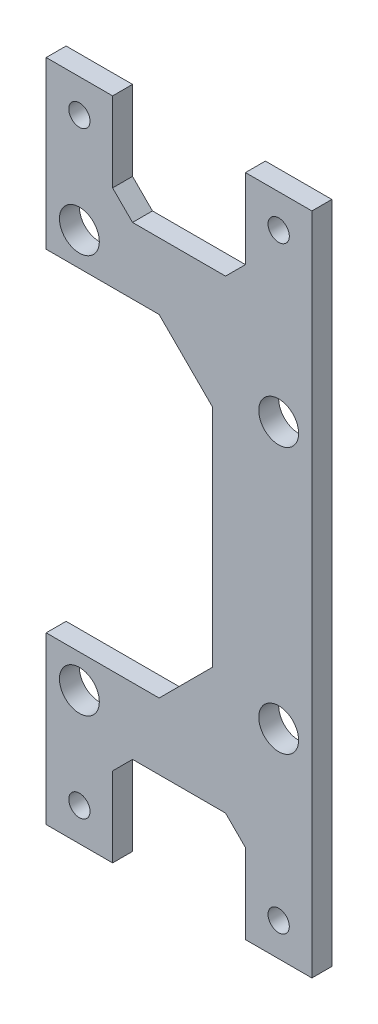
ISO-10303-21;
HEADER;
FILE_DESCRIPTION(('STEP AP214'),'2;1');
FILE_NAME('part.step','',(''),(''),'','','');
FILE_SCHEMA(('AUTOMOTIVE_DESIGN { 1 0 10303 214 1 1 1 1 }'));
ENDSEC;
DATA;
#1=APPLICATION_CONTEXT('core data for automotive mechanical design processes');
#2=APPLICATION_PROTOCOL_DEFINITION('international standard','automotive_design',2000,#1);
#3=PRODUCT_CONTEXT('',#1,'mechanical');
#4=PRODUCT('Part','Part','',(#3));
#5=PRODUCT_RELATED_PRODUCT_CATEGORY('part','',(#4));
#6=PRODUCT_DEFINITION_FORMATION('','',#4);
#7=PRODUCT_DEFINITION_CONTEXT('part definition',#1,'design');
#8=PRODUCT_DEFINITION('design','',#6,#7);
#9=PRODUCT_DEFINITION_SHAPE('','',#8);
#10=(LENGTH_UNIT() NAMED_UNIT(*) SI_UNIT(.MILLI.,.METRE.));
#11=(NAMED_UNIT(*) PLANE_ANGLE_UNIT() SI_UNIT($,.RADIAN.));
#12=(NAMED_UNIT(*) SI_UNIT($,.STERADIAN.) SOLID_ANGLE_UNIT());
#13=UNCERTAINTY_MEASURE_WITH_UNIT(LENGTH_MEASURE(1.E-05),#10,'distance_accuracy_value','');
#14=(GEOMETRIC_REPRESENTATION_CONTEXT(3) GLOBAL_UNCERTAINTY_ASSIGNED_CONTEXT((#13)) GLOBAL_UNIT_ASSIGNED_CONTEXT((#10,
#11,#12)) REPRESENTATION_CONTEXT('',''));
#15=CARTESIAN_POINT('',(0.,0.,0.));
#16=DIRECTION('',(0.,0.,1.));
#17=DIRECTION('',(1.,0.,0.));
#18=AXIS2_PLACEMENT_3D('',#15,#16,#17);
#19=CARTESIAN_POINT('',(0.,0.,3.));
#20=DIRECTION('',(1.,0.,0.));
#21=DIRECTION('',(0.,0.,-1.));
#22=AXIS2_PLACEMENT_3D('',#19,#20,#21);
#23=PLANE('',#22);
#24=DIRECTION('',(0.,-1.,0.));
#25=VECTOR('',#24,1.);
#26=CARTESIAN_POINT('',(0.,0.,0.));
#27=LINE('',#26,#25);
#28=CARTESIAN_POINT('',(0.,100.,0.));
#29=VERTEX_POINT('',#28);
#30=CARTESIAN_POINT('',(0.,75.,0.));
#31=VERTEX_POINT('',#30);
#32=EDGE_CURVE('E227',#29,#31,#27,.T.);
#33=ORIENTED_EDGE('',*,*,#32,.T.);
#34=DIRECTION('',(0.,0.,-1.));
#35=VECTOR('',#34,1.);
#36=CARTESIAN_POINT('',(0.,75.,3.));
#37=LINE('',#36,#35);
#38=CARTESIAN_POINT('',(0.,75.,3.));
#39=VERTEX_POINT('',#38);
#40=EDGE_CURVE('E201',#39,#31,#37,.T.);
#41=ORIENTED_EDGE('',*,*,#40,.F.);
#42=DIRECTION('',(0.,-1.,0.));
#43=VECTOR('',#42,1.);
#44=CARTESIAN_POINT('',(0.,0.,3.));
#45=LINE('',#44,#43);
#46=CARTESIAN_POINT('',(0.,100.,3.));
#47=VERTEX_POINT('',#46);
#48=EDGE_CURVE('E207',#47,#39,#45,.T.);
#49=ORIENTED_EDGE('',*,*,#48,.F.);
#50=DIRECTION('',(0.,0.,-1.));
#51=VECTOR('',#50,1.);
#52=CARTESIAN_POINT('',(0.,100.,3.));
#53=LINE('',#52,#51);
#54=EDGE_CURVE('E226',#47,#29,#53,.T.);
#55=ORIENTED_EDGE('',*,*,#54,.T.);
#56=EDGE_LOOP('',(#33,#41,#49,#55));
#57=FACE_BOUND('',#56,.T.);
#58=ADVANCED_FACE('F35',(#57),#23,.F.);
#59=CARTESIAN_POINT('',(0.,0.,3.));
#60=DIRECTION('',(0.,1.,0.));
#61=DIRECTION('',(0.,0.,1.));
#62=AXIS2_PLACEMENT_3D('',#59,#60,#61);
#63=PLANE('',#62);
#64=DIRECTION('',(1.,0.,0.));
#65=VECTOR('',#64,1.);
#66=CARTESIAN_POINT('',(0.,0.,0.));
#67=LINE('',#66,#65);
#68=CARTESIAN_POINT('',(0.,0.,0.));
#69=VERTEX_POINT('',#68);
#70=CARTESIAN_POINT('',(10.,0.,0.));
#71=VERTEX_POINT('',#70);
#72=EDGE_CURVE('E232',#69,#71,#67,.T.);
#73=ORIENTED_EDGE('',*,*,#72,.T.);
#74=DIRECTION('',(0.,0.,1.));
#75=VECTOR('',#74,1.);
#76=CARTESIAN_POINT('',(10.,0.,0.));
#77=LINE('',#76,#75);
#78=CARTESIAN_POINT('',(10.,0.,3.));
#79=VERTEX_POINT('',#78);
#80=EDGE_CURVE('E383',#71,#79,#77,.T.);
#81=ORIENTED_EDGE('',*,*,#80,.T.);
#82=DIRECTION('',(1.,0.,0.));
#83=VECTOR('',#82,1.);
#84=CARTESIAN_POINT('',(0.,0.,3.));
#85=LINE('',#84,#83);
#86=CARTESIAN_POINT('',(0.,0.,3.));
#87=VERTEX_POINT('',#86);
#88=EDGE_CURVE('E218',#87,#79,#85,.T.);
#89=ORIENTED_EDGE('',*,*,#88,.F.);
#90=DIRECTION('',(0.,0.,-1.));
#91=VECTOR('',#90,1.);
#92=CARTESIAN_POINT('',(0.,0.,3.));
#93=LINE('',#92,#91);
#94=EDGE_CURVE('E206',#87,#69,#93,.T.);
#95=ORIENTED_EDGE('',*,*,#94,.T.);
#96=EDGE_LOOP('',(#73,#81,#89,#95));
#97=FACE_BOUND('',#96,.T.);
#98=ADVANCED_FACE('F313',(#97),#63,.F.);
#99=CARTESIAN_POINT('',(0.,100.,3.));
#100=DIRECTION('',(0.,-1.,0.));
#101=DIRECTION('',(1.,0.,0.));
#102=AXIS2_PLACEMENT_3D('',#99,#100,#101);
#103=PLANE('',#102);
#104=DIRECTION('',(-1.,0.,0.));
#105=VECTOR('',#104,1.);
#106=CARTESIAN_POINT('',(0.,100.,3.));
#107=LINE('',#106,#105);
#108=CARTESIAN_POINT('',(10.,100.,3.));
#109=VERTEX_POINT('',#108);
#110=EDGE_CURVE('E222',#109,#47,#107,.T.);
#111=ORIENTED_EDGE('',*,*,#110,.F.);
#112=DIRECTION('',(0.,0.,1.));
#113=VECTOR('',#112,1.);
#114=CARTESIAN_POINT('',(10.,100.,0.));
#115=LINE('',#114,#113);
#116=CARTESIAN_POINT('',(10.,100.,0.));
#117=VERTEX_POINT('',#116);
#118=EDGE_CURVE('E368',#117,#109,#115,.T.);
#119=ORIENTED_EDGE('',*,*,#118,.F.);
#120=DIRECTION('',(-1.,0.,0.));
#121=VECTOR('',#120,1.);
#122=CARTESIAN_POINT('',(0.,100.,0.));
#123=LINE('',#122,#121);
#124=EDGE_CURVE('E212',#117,#29,#123,.T.);
#125=ORIENTED_EDGE('',*,*,#124,.T.);
#126=ORIENTED_EDGE('',*,*,#54,.F.);
#127=EDGE_LOOP('',(#111,#119,#125,#126));
#128=FACE_BOUND('',#127,.T.);
#129=ADVANCED_FACE('F319',(#128),#103,.F.);
#130=CARTESIAN_POINT('',(0.,0.,3.));
#131=DIRECTION('',(0.,0.,-1.));
#132=DIRECTION('',(-1.,0.,0.));
#133=AXIS2_PLACEMENT_3D('',#130,#131,#132);
#134=PLANE('',#133);
#135=ORIENTED_EDGE('',*,*,#48,.T.);
#136=DIRECTION('',(1.,0.,0.));
#137=VECTOR('',#136,1.);
#138=CARTESIAN_POINT('',(25.,75.,3.));
#139=LINE('',#138,#137);
#140=CARTESIAN_POINT('',(17.,75.,3.));
#141=VERTEX_POINT('',#140);
#142=EDGE_CURVE('E191',#39,#141,#139,.T.);
#143=ORIENTED_EDGE('',*,*,#142,.T.);
#144=DIRECTION('',(-0.707106781186545,0.70710678118655,0.));
#145=VECTOR('',#144,1.);
#146=CARTESIAN_POINT('',(46.0000000000001,45.9999999999998,3.));
#147=LINE('',#146,#145);
#148=CARTESIAN_POINT('',(25.,67.,3.));
#149=VERTEX_POINT('',#148);
#150=EDGE_CURVE('E293',#141,#149,#147,.F.);
#151=ORIENTED_EDGE('',*,*,#150,.T.);
#152=DIRECTION('',(0.,-1.,0.));
#153=VECTOR('',#152,1.);
#154=CARTESIAN_POINT('',(25.,75.,3.));
#155=LINE('',#154,#153);
#156=CARTESIAN_POINT('',(25.,33.,3.));
#157=VERTEX_POINT('',#156);
#158=EDGE_CURVE('E192',#149,#157,#155,.T.);
#159=ORIENTED_EDGE('',*,*,#158,.T.);
#160=DIRECTION('',(0.707106781186551,0.707106781186544,0.));
#161=VECTOR('',#160,1.);
#162=CARTESIAN_POINT('',(-4.00000000000012,4.00000000000017,3.));
#163=LINE('',#162,#161);
#164=CARTESIAN_POINT('',(16.9999999999999,25.,3.));
#165=VERTEX_POINT('',#164);
#166=EDGE_CURVE('E11',#157,#165,#163,.F.);
#167=ORIENTED_EDGE('',*,*,#166,.T.);
#168=DIRECTION('',(-1.,0.,0.));
#169=VECTOR('',#168,1.);
#170=CARTESIAN_POINT('',(25.,25.,3.));
#171=LINE('',#170,#169);
#172=CARTESIAN_POINT('',(0.,25.,3.));
#173=VERTEX_POINT('',#172);
#174=EDGE_CURVE('E181',#165,#173,#171,.T.);
#175=ORIENTED_EDGE('',*,*,#174,.T.);
#176=EDGE_CURVE('E188',#173,#87,#45,.T.);
#177=ORIENTED_EDGE('',*,*,#176,.T.);
#178=ORIENTED_EDGE('',*,*,#88,.T.);
#179=DIRECTION('',(0.,-1.,0.));
#180=VECTOR('',#179,1.);
#181=CARTESIAN_POINT('',(10.,15.,3.));
#182=LINE('',#181,#180);
#183=CARTESIAN_POINT('',(10.,12.,3.));
#184=VERTEX_POINT('',#183);
#185=EDGE_CURVE('E384',#184,#79,#182,.T.);
#186=ORIENTED_EDGE('',*,*,#185,.F.);
#187=DIRECTION('',(-0.707106781186544,-0.707106781186551,0.));
#188=VECTOR('',#187,1.);
#189=CARTESIAN_POINT('',(-0.999999999999937,0.999999999999928,3.));
#190=LINE('',#189,#188);
#191=CARTESIAN_POINT('',(13.,15.,3.));
#192=VERTEX_POINT('',#191);
#193=EDGE_CURVE('E266',#184,#192,#190,.F.);
#194=ORIENTED_EDGE('',*,*,#193,.T.);
#195=DIRECTION('',(-1.,0.,0.));
#196=VECTOR('',#195,1.);
#197=CARTESIAN_POINT('',(10.,15.,3.));
#198=LINE('',#197,#196);
#199=CARTESIAN_POINT('',(27.,15.,3.));
#200=VERTEX_POINT('',#199);
#201=EDGE_CURVE('E377',#200,#192,#198,.T.);
#202=ORIENTED_EDGE('',*,*,#201,.F.);
#203=DIRECTION('',(-0.707106781186552,0.707106781186543,0.));
#204=VECTOR('',#203,1.);
#205=CARTESIAN_POINT('',(20.9999999999998,21.0000000000001,3.));
#206=LINE('',#205,#204);
#207=CARTESIAN_POINT('',(30.,12.,3.));
#208=VERTEX_POINT('',#207);
#209=EDGE_CURVE('E270',#200,#208,#206,.F.);
#210=ORIENTED_EDGE('',*,*,#209,.T.);
#211=DIRECTION('',(0.,1.,0.));
#212=VECTOR('',#211,1.);
#213=CARTESIAN_POINT('',(30.,15.,3.));
#214=LINE('',#213,#212);
#215=CARTESIAN_POINT('',(30.,0.,3.));
#216=VERTEX_POINT('',#215);
#217=EDGE_CURVE('E386',#216,#208,#214,.T.);
#218=ORIENTED_EDGE('',*,*,#217,.F.);
#219=CARTESIAN_POINT('',(40.,0.,3.));
#220=VERTEX_POINT('',#219);
#221=EDGE_CURVE('E210',#216,#220,#85,.T.);
#222=ORIENTED_EDGE('',*,*,#221,.T.);
#223=DIRECTION('',(0.,1.,0.));
#224=VECTOR('',#223,1.);
#225=CARTESIAN_POINT('',(40.,0.,3.));
#226=LINE('',#225,#224);
#227=CARTESIAN_POINT('',(40.,100.,3.));
#228=VERTEX_POINT('',#227);
#229=EDGE_CURVE('E220',#220,#228,#226,.T.);
#230=ORIENTED_EDGE('',*,*,#229,.T.);
#231=CARTESIAN_POINT('',(30.,100.,3.));
#232=VERTEX_POINT('',#231);
#233=EDGE_CURVE('E223',#228,#232,#107,.T.);
#234=ORIENTED_EDGE('',*,*,#233,.T.);
#235=DIRECTION('',(0.,1.,0.));
#236=VECTOR('',#235,1.);
#237=CARTESIAN_POINT('',(30.,100.,3.));
#238=LINE('',#237,#236);
#239=CARTESIAN_POINT('',(30.,88.,3.));
#240=VERTEX_POINT('',#239);
#241=EDGE_CURVE('E367',#240,#232,#238,.T.);
#242=ORIENTED_EDGE('',*,*,#241,.F.);
#243=DIRECTION('',(0.707106781186543,0.707106781186552,0.));
#244=VECTOR('',#243,1.);
#245=CARTESIAN_POINT('',(-28.9999999999998,28.9999999999994,3.));
#246=LINE('',#245,#244);
#247=CARTESIAN_POINT('',(27.,85.,3.));
#248=VERTEX_POINT('',#247);
#249=EDGE_CURVE('E278',#240,#248,#246,.F.);
#250=ORIENTED_EDGE('',*,*,#249,.T.);
#251=DIRECTION('',(1.,0.,0.));
#252=VECTOR('',#251,1.);
#253=CARTESIAN_POINT('',(10.,85.,3.));
#254=LINE('',#253,#252);
#255=CARTESIAN_POINT('',(13.0000000000001,85.,3.));
#256=VERTEX_POINT('',#255);
#257=EDGE_CURVE('E529',#256,#248,#254,.T.);
#258=ORIENTED_EDGE('',*,*,#257,.F.);
#259=DIRECTION('',(0.707106781186551,-0.707106781186544,0.));
#260=VECTOR('',#259,1.);
#261=CARTESIAN_POINT('',(49.,49.0000000000004,3.));
#262=LINE('',#261,#260);
#263=CARTESIAN_POINT('',(10.,88.,3.));
#264=VERTEX_POINT('',#263);
#265=EDGE_CURVE('E274',#256,#264,#262,.F.);
#266=ORIENTED_EDGE('',*,*,#265,.T.);
#267=DIRECTION('',(0.,-1.,0.));
#268=VECTOR('',#267,1.);
#269=CARTESIAN_POINT('',(10.,100.,3.));
#270=LINE('',#269,#268);
#271=EDGE_CURVE('E393',#109,#264,#270,.T.);
#272=ORIENTED_EDGE('',*,*,#271,.F.);
#273=ORIENTED_EDGE('',*,*,#110,.T.);
#274=EDGE_LOOP('',(#135,#143,#151,#159,#167,#175,#177,#178,#186,#194,#202,#210,#218,#222,#230,
#234,#242,#250,#258,#266,#272,#273));
#275=FACE_BOUND('',#274,.T.);
#276=CARTESIAN_POINT('',(5.,95.,3.));
#277=DIRECTION('',(0.,0.,1.));
#278=DIRECTION('',(1.,0.,0.));
#279=AXIS2_PLACEMENT_3D('',#276,#277,#278);
#280=CIRCLE('',#279,1.60000000000002);
#281=CARTESIAN_POINT('',(6.60000000000002,95.,3.));
#282=VERTEX_POINT('',#281);
#283=EDGE_CURVE('E436',#282,#282,#280,.T.);
#284=ORIENTED_EDGE('',*,*,#283,.F.);
#285=EDGE_LOOP('',(#284));
#286=FACE_BOUND('',#285,.T.);
#287=CARTESIAN_POINT('',(35.,95.,3.));
#288=DIRECTION('',(0.,0.,1.));
#289=DIRECTION('',(1.,0.,0.));
#290=AXIS2_PLACEMENT_3D('',#287,#288,#289);
#291=CIRCLE('',#290,1.60000000000001);
#292=CARTESIAN_POINT('',(36.6,95.,3.));
#293=VERTEX_POINT('',#292);
#294=EDGE_CURVE('E432',#293,#293,#291,.T.);
#295=ORIENTED_EDGE('',*,*,#294,.F.);
#296=EDGE_LOOP('',(#295));
#297=FACE_BOUND('',#296,.T.);
#298=CARTESIAN_POINT('',(5.,80.,3.));
#299=DIRECTION('',(0.,0.,1.));
#300=DIRECTION('',(1.,0.,0.));
#301=AXIS2_PLACEMENT_3D('',#298,#299,#300);
#302=CIRCLE('',#301,3.);
#303=CARTESIAN_POINT('',(8.,80.,3.));
#304=VERTEX_POINT('',#303);
#305=EDGE_CURVE('E426',#304,#304,#302,.T.);
#306=ORIENTED_EDGE('',*,*,#305,.F.);
#307=EDGE_LOOP('',(#306));
#308=FACE_BOUND('',#307,.T.);
#309=CARTESIAN_POINT('',(35.,70.,3.));
#310=DIRECTION('',(0.,0.,1.));
#311=DIRECTION('',(1.,0.,0.));
#312=AXIS2_PLACEMENT_3D('',#309,#310,#311);
#313=CIRCLE('',#312,3.);
#314=CARTESIAN_POINT('',(38.,70.,3.));
#315=VERTEX_POINT('',#314);
#316=EDGE_CURVE('E420',#315,#315,#313,.T.);
#317=ORIENTED_EDGE('',*,*,#316,.F.);
#318=EDGE_LOOP('',(#317));
#319=FACE_BOUND('',#318,.T.);
#320=CARTESIAN_POINT('',(5.,20.,3.));
#321=DIRECTION('',(0.,0.,1.));
#322=DIRECTION('',(1.,0.,0.));
#323=AXIS2_PLACEMENT_3D('',#320,#321,#322);
#324=CIRCLE('',#323,3.);
#325=CARTESIAN_POINT('',(8.,20.,3.));
#326=VERTEX_POINT('',#325);
#327=EDGE_CURVE('E414',#326,#326,#324,.T.);
#328=ORIENTED_EDGE('',*,*,#327,.F.);
#329=EDGE_LOOP('',(#328));
#330=FACE_BOUND('',#329,.T.);
#331=CARTESIAN_POINT('',(35.,30.,3.));
#332=DIRECTION('',(0.,0.,1.));
#333=DIRECTION('',(1.,0.,0.));
#334=AXIS2_PLACEMENT_3D('',#331,#332,#333);
#335=CIRCLE('',#334,3.);
#336=CARTESIAN_POINT('',(38.,30.,3.));
#337=VERTEX_POINT('',#336);
#338=EDGE_CURVE('E408',#337,#337,#335,.T.);
#339=ORIENTED_EDGE('',*,*,#338,.F.);
#340=EDGE_LOOP('',(#339));
#341=FACE_BOUND('',#340,.T.);
#342=CARTESIAN_POINT('',(5.,5.,3.));
#343=DIRECTION('',(0.,0.,1.));
#344=DIRECTION('',(1.,0.,0.));
#345=AXIS2_PLACEMENT_3D('',#342,#343,#344);
#346=CIRCLE('',#345,1.6);
#347=CARTESIAN_POINT('',(6.6,5.,3.));
#348=VERTEX_POINT('',#347);
#349=EDGE_CURVE('E402',#348,#348,#346,.T.);
#350=ORIENTED_EDGE('',*,*,#349,.F.);
#351=EDGE_LOOP('',(#350));
#352=FACE_BOUND('',#351,.T.);
#353=CARTESIAN_POINT('',(35.,5.,3.));
#354=DIRECTION('',(0.,0.,1.));
#355=DIRECTION('',(1.,0.,0.));
#356=AXIS2_PLACEMENT_3D('',#353,#354,#355);
#357=CIRCLE('',#356,1.6);
#358=CARTESIAN_POINT('',(36.6,5.,3.));
#359=VERTEX_POINT('',#358);
#360=EDGE_CURVE('E396',#359,#359,#357,.T.);
#361=ORIENTED_EDGE('',*,*,#360,.F.);
#362=EDGE_LOOP('',(#361));
#363=FACE_BOUND('',#362,.T.);
#364=ADVANCED_FACE('F184',(#275,#286,#297,#308,#319,#330,#341,#352,#363),#134,.F.);
#365=CARTESIAN_POINT('',(0.,0.,0.));
#366=DIRECTION('',(0.,0.,-1.));
#367=DIRECTION('',(-1.,0.,0.));
#368=AXIS2_PLACEMENT_3D('',#365,#366,#367);
#369=PLANE('',#368);
#370=DIRECTION('',(1.,0.,0.));
#371=VECTOR('',#370,1.);
#372=CARTESIAN_POINT('',(25.,75.,0.));
#373=LINE('',#372,#371);
#374=CARTESIAN_POINT('',(17.,75.,0.));
#375=VERTEX_POINT('',#374);
#376=EDGE_CURVE('E511',#31,#375,#373,.T.);
#377=ORIENTED_EDGE('',*,*,#376,.F.);
#378=ORIENTED_EDGE('',*,*,#32,.F.);
#379=ORIENTED_EDGE('',*,*,#124,.F.);
#380=DIRECTION('',(0.,-1.,0.));
#381=VECTOR('',#380,1.);
#382=CARTESIAN_POINT('',(10.,100.,0.));
#383=LINE('',#382,#381);
#384=CARTESIAN_POINT('',(10.,88.,0.));
#385=VERTEX_POINT('',#384);
#386=EDGE_CURVE('E523',#117,#385,#383,.T.);
#387=ORIENTED_EDGE('',*,*,#386,.T.);
#388=DIRECTION('',(-0.707106781186551,0.707106781186544,0.));
#389=VECTOR('',#388,1.);
#390=CARTESIAN_POINT('',(13.0000000000001,85.,0.));
#391=LINE('',#390,#389);
#392=CARTESIAN_POINT('',(13.0000000000001,85.,0.));
#393=VERTEX_POINT('',#392);
#394=EDGE_CURVE('E276',#385,#393,#391,.F.);
#395=ORIENTED_EDGE('',*,*,#394,.T.);
#396=DIRECTION('',(1.,0.,0.));
#397=VECTOR('',#396,1.);
#398=CARTESIAN_POINT('',(10.,85.,0.));
#399=LINE('',#398,#397);
#400=CARTESIAN_POINT('',(27.,85.,0.));
#401=VERTEX_POINT('',#400);
#402=EDGE_CURVE('E363',#393,#401,#399,.T.);
#403=ORIENTED_EDGE('',*,*,#402,.T.);
#404=DIRECTION('',(-0.707106781186543,-0.707106781186552,0.));
#405=VECTOR('',#404,1.);
#406=CARTESIAN_POINT('',(30.,88.,0.));
#407=LINE('',#406,#405);
#408=CARTESIAN_POINT('',(30.,88.,0.));
#409=VERTEX_POINT('',#408);
#410=EDGE_CURVE('E280',#401,#409,#407,.F.);
#411=ORIENTED_EDGE('',*,*,#410,.T.);
#412=DIRECTION('',(0.,1.,0.));
#413=VECTOR('',#412,1.);
#414=CARTESIAN_POINT('',(30.,100.,0.));
#415=LINE('',#414,#413);
#416=CARTESIAN_POINT('',(30.,100.,0.));
#417=VERTEX_POINT('',#416);
#418=EDGE_CURVE('E356',#409,#417,#415,.T.);
#419=ORIENTED_EDGE('',*,*,#418,.T.);
#420=CARTESIAN_POINT('',(40.,100.,0.));
#421=VERTEX_POINT('',#420);
#422=EDGE_CURVE('E208',#421,#417,#123,.T.);
#423=ORIENTED_EDGE('',*,*,#422,.F.);
#424=DIRECTION('',(0.,1.,0.));
#425=VECTOR('',#424,1.);
#426=CARTESIAN_POINT('',(40.,0.,0.));
#427=LINE('',#426,#425);
#428=CARTESIAN_POINT('',(40.,0.,0.));
#429=VERTEX_POINT('',#428);
#430=EDGE_CURVE('E235',#429,#421,#427,.T.);
#431=ORIENTED_EDGE('',*,*,#430,.F.);
#432=CARTESIAN_POINT('',(30.,0.,0.));
#433=VERTEX_POINT('',#432);
#434=EDGE_CURVE('E230',#433,#429,#67,.T.);
#435=ORIENTED_EDGE('',*,*,#434,.F.);
#436=DIRECTION('',(0.,1.,0.));
#437=VECTOR('',#436,1.);
#438=CARTESIAN_POINT('',(30.,15.,0.));
#439=LINE('',#438,#437);
#440=CARTESIAN_POINT('',(30.,12.,0.));
#441=VERTEX_POINT('',#440);
#442=EDGE_CURVE('E376',#433,#441,#439,.T.);
#443=ORIENTED_EDGE('',*,*,#442,.T.);
#444=DIRECTION('',(0.707106781186552,-0.707106781186543,0.));
#445=VECTOR('',#444,1.);
#446=CARTESIAN_POINT('',(27.,15.,0.));
#447=LINE('',#446,#445);
#448=CARTESIAN_POINT('',(27.,15.,0.));
#449=VERTEX_POINT('',#448);
#450=EDGE_CURVE('E272',#441,#449,#447,.F.);
#451=ORIENTED_EDGE('',*,*,#450,.T.);
#452=DIRECTION('',(-1.,0.,0.));
#453=VECTOR('',#452,1.);
#454=CARTESIAN_POINT('',(10.,15.,0.));
#455=LINE('',#454,#453);
#456=CARTESIAN_POINT('',(13.,15.,0.));
#457=VERTEX_POINT('',#456);
#458=EDGE_CURVE('E380',#449,#457,#455,.T.);
#459=ORIENTED_EDGE('',*,*,#458,.T.);
#460=DIRECTION('',(0.707106781186544,0.707106781186551,0.));
#461=VECTOR('',#460,1.);
#462=CARTESIAN_POINT('',(10.,12.,0.));
#463=LINE('',#462,#461);
#464=CARTESIAN_POINT('',(10.,12.,0.));
#465=VERTEX_POINT('',#464);
#466=EDGE_CURVE('E268',#457,#465,#463,.F.);
#467=ORIENTED_EDGE('',*,*,#466,.T.);
#468=DIRECTION('',(0.,-1.,0.));
#469=VECTOR('',#468,1.);
#470=CARTESIAN_POINT('',(10.,15.,0.));
#471=LINE('',#470,#469);
#472=EDGE_CURVE('E374',#465,#71,#471,.T.);
#473=ORIENTED_EDGE('',*,*,#472,.T.);
#474=ORIENTED_EDGE('',*,*,#72,.F.);
#475=CARTESIAN_POINT('',(0.,25.,0.));
#476=VERTEX_POINT('',#475);
#477=EDGE_CURVE('E231',#476,#69,#27,.T.);
#478=ORIENTED_EDGE('',*,*,#477,.F.);
#479=DIRECTION('',(-1.,0.,0.));
#480=VECTOR('',#479,1.);
#481=CARTESIAN_POINT('',(25.,25.,0.));
#482=LINE('',#481,#480);
#483=CARTESIAN_POINT('',(16.9999999999999,25.,0.));
#484=VERTEX_POINT('',#483);
#485=EDGE_CURVE('E198',#484,#476,#482,.T.);
#486=ORIENTED_EDGE('',*,*,#485,.F.);
#487=DIRECTION('',(-0.707106781186551,-0.707106781186544,0.));
#488=VECTOR('',#487,1.);
#489=CARTESIAN_POINT('',(16.9999999999999,25.,0.));
#490=LINE('',#489,#488);
#491=CARTESIAN_POINT('',(25.,33.,0.));
#492=VERTEX_POINT('',#491);
#493=EDGE_CURVE('E44',#484,#492,#490,.F.);
#494=ORIENTED_EDGE('',*,*,#493,.T.);
#495=DIRECTION('',(0.,-1.,0.));
#496=VECTOR('',#495,1.);
#497=CARTESIAN_POINT('',(25.,75.,0.));
#498=LINE('',#497,#496);
#499=CARTESIAN_POINT('',(25.,67.,0.));
#500=VERTEX_POINT('',#499);
#501=EDGE_CURVE('E300',#500,#492,#498,.T.);
#502=ORIENTED_EDGE('',*,*,#501,.F.);
#503=DIRECTION('',(0.707106781186545,-0.70710678118655,0.));
#504=VECTOR('',#503,1.);
#505=CARTESIAN_POINT('',(25.,67.,0.));
#506=LINE('',#505,#504);
#507=EDGE_CURVE('E291',#500,#375,#506,.F.);
#508=ORIENTED_EDGE('',*,*,#507,.T.);
#509=EDGE_LOOP('',(#377,#378,#379,#387,#395,#403,#411,#419,#423,#431,#435,#443,#451,#459,#467,
#473,#474,#478,#486,#494,#502,#508));
#510=FACE_BOUND('',#509,.T.);
#511=CARTESIAN_POINT('',(5.,5.,0.));
#512=DIRECTION('',(0.,0.,1.));
#513=DIRECTION('',(1.,0.,0.));
#514=AXIS2_PLACEMENT_3D('',#511,#512,#513);
#515=CIRCLE('',#514,1.6);
#516=CARTESIAN_POINT('',(6.6,5.,0.));
#517=VERTEX_POINT('',#516);
#518=EDGE_CURVE('E399',#517,#517,#515,.T.);
#519=ORIENTED_EDGE('',*,*,#518,.T.);
#520=EDGE_LOOP('',(#519));
#521=FACE_BOUND('',#520,.T.);
#522=CARTESIAN_POINT('',(5.,20.,0.));
#523=DIRECTION('',(0.,0.,1.));
#524=DIRECTION('',(1.,0.,0.));
#525=AXIS2_PLACEMENT_3D('',#522,#523,#524);
#526=CIRCLE('',#525,3.);
#527=CARTESIAN_POINT('',(8.,20.,0.));
#528=VERTEX_POINT('',#527);
#529=EDGE_CURVE('E411',#528,#528,#526,.T.);
#530=ORIENTED_EDGE('',*,*,#529,.T.);
#531=EDGE_LOOP('',(#530));
#532=FACE_BOUND('',#531,.T.);
#533=CARTESIAN_POINT('',(5.,80.,0.));
#534=DIRECTION('',(0.,0.,1.));
#535=DIRECTION('',(1.,0.,0.));
#536=AXIS2_PLACEMENT_3D('',#533,#534,#535);
#537=CIRCLE('',#536,3.);
#538=CARTESIAN_POINT('',(8.,80.,0.));
#539=VERTEX_POINT('',#538);
#540=EDGE_CURVE('E423',#539,#539,#537,.T.);
#541=ORIENTED_EDGE('',*,*,#540,.T.);
#542=EDGE_LOOP('',(#541));
#543=FACE_BOUND('',#542,.T.);
#544=CARTESIAN_POINT('',(5.,95.,0.));
#545=DIRECTION('',(0.,0.,1.));
#546=DIRECTION('',(1.,0.,0.));
#547=AXIS2_PLACEMENT_3D('',#544,#545,#546);
#548=CIRCLE('',#547,1.60000000000002);
#549=CARTESIAN_POINT('',(6.60000000000002,95.,0.));
#550=VERTEX_POINT('',#549);
#551=EDGE_CURVE('E216',#550,#550,#548,.T.);
#552=ORIENTED_EDGE('',*,*,#551,.T.);
#553=EDGE_LOOP('',(#552));
#554=FACE_BOUND('',#553,.T.);
#555=CARTESIAN_POINT('',(35.,95.,0.));
#556=DIRECTION('',(0.,0.,1.));
#557=DIRECTION('',(1.,0.,0.));
#558=AXIS2_PLACEMENT_3D('',#555,#556,#557);
#559=CIRCLE('',#558,1.60000000000001);
#560=CARTESIAN_POINT('',(36.6,95.,0.));
#561=VERTEX_POINT('',#560);
#562=EDGE_CURVE('E429',#561,#561,#559,.T.);
#563=ORIENTED_EDGE('',*,*,#562,.T.);
#564=EDGE_LOOP('',(#563));
#565=FACE_BOUND('',#564,.T.);
#566=CARTESIAN_POINT('',(35.,70.,0.));
#567=DIRECTION('',(0.,0.,1.));
#568=DIRECTION('',(1.,0.,0.));
#569=AXIS2_PLACEMENT_3D('',#566,#567,#568);
#570=CIRCLE('',#569,3.);
#571=CARTESIAN_POINT('',(38.,70.,0.));
#572=VERTEX_POINT('',#571);
#573=EDGE_CURVE('E417',#572,#572,#570,.T.);
#574=ORIENTED_EDGE('',*,*,#573,.T.);
#575=EDGE_LOOP('',(#574));
#576=FACE_BOUND('',#575,.T.);
#577=CARTESIAN_POINT('',(35.,30.,0.));
#578=DIRECTION('',(0.,0.,1.));
#579=DIRECTION('',(1.,0.,0.));
#580=AXIS2_PLACEMENT_3D('',#577,#578,#579);
#581=CIRCLE('',#580,3.);
#582=CARTESIAN_POINT('',(38.,30.,0.));
#583=VERTEX_POINT('',#582);
#584=EDGE_CURVE('E405',#583,#583,#581,.T.);
#585=ORIENTED_EDGE('',*,*,#584,.T.);
#586=EDGE_LOOP('',(#585));
#587=FACE_BOUND('',#586,.T.);
#588=CARTESIAN_POINT('',(35.,5.,0.));
#589=DIRECTION('',(0.,0.,1.));
#590=DIRECTION('',(1.,0.,0.));
#591=AXIS2_PLACEMENT_3D('',#588,#589,#590);
#592=CIRCLE('',#591,1.6);
#593=CARTESIAN_POINT('',(36.6,5.,0.));
#594=VERTEX_POINT('',#593);
#595=EDGE_CURVE('E370',#594,#594,#592,.T.);
#596=ORIENTED_EDGE('',*,*,#595,.T.);
#597=EDGE_LOOP('',(#596));
#598=FACE_BOUND('',#597,.T.);
#599=ADVANCED_FACE('F298',(#510,#521,#532,#543,#554,#565,#576,#587,#598),#369,.T.);
#600=ORIENTED_EDGE('',*,*,#176,.F.);
#601=DIRECTION('',(0.,0.,-1.));
#602=VECTOR('',#601,1.);
#603=CARTESIAN_POINT('',(0.,25.,3.));
#604=LINE('',#603,#602);
#605=EDGE_CURVE('E195',#173,#476,#604,.T.);
#606=ORIENTED_EDGE('',*,*,#605,.T.);
#607=ORIENTED_EDGE('',*,*,#477,.T.);
#608=ORIENTED_EDGE('',*,*,#94,.F.);
#609=EDGE_LOOP('',(#600,#606,#607,#608));
#610=FACE_BOUND('',#609,.T.);
#611=ADVANCED_FACE('F204',(#610),#23,.F.);
#612=ORIENTED_EDGE('',*,*,#221,.F.);
#613=DIRECTION('',(0.,0.,1.));
#614=VECTOR('',#613,1.);
#615=CARTESIAN_POINT('',(30.,0.,0.));
#616=LINE('',#615,#614);
#617=EDGE_CURVE('E391',#433,#216,#616,.T.);
#618=ORIENTED_EDGE('',*,*,#617,.F.);
#619=ORIENTED_EDGE('',*,*,#434,.T.);
#620=DIRECTION('',(0.,0.,-1.));
#621=VECTOR('',#620,1.);
#622=CARTESIAN_POINT('',(40.,0.,3.));
#623=LINE('',#622,#621);
#624=EDGE_CURVE('E242',#220,#429,#623,.T.);
#625=ORIENTED_EDGE('',*,*,#624,.F.);
#626=EDGE_LOOP('',(#612,#618,#619,#625));
#627=FACE_BOUND('',#626,.T.);
#628=ADVANCED_FACE('F322',(#627),#63,.F.);
#629=CARTESIAN_POINT('',(40.,0.,3.));
#630=DIRECTION('',(-1.,0.,0.));
#631=DIRECTION('',(0.,0.,1.));
#632=AXIS2_PLACEMENT_3D('',#629,#630,#631);
#633=PLANE('',#632);
#634=ORIENTED_EDGE('',*,*,#430,.T.);
#635=DIRECTION('',(0.,0.,-1.));
#636=VECTOR('',#635,1.);
#637=CARTESIAN_POINT('',(40.,100.,3.));
#638=LINE('',#637,#636);
#639=EDGE_CURVE('E239',#228,#421,#638,.T.);
#640=ORIENTED_EDGE('',*,*,#639,.F.);
#641=ORIENTED_EDGE('',*,*,#229,.F.);
#642=ORIENTED_EDGE('',*,*,#624,.T.);
#643=EDGE_LOOP('',(#634,#640,#641,#642));
#644=FACE_BOUND('',#643,.T.);
#645=ADVANCED_FACE('F329',(#644),#633,.F.);
#646=ORIENTED_EDGE('',*,*,#422,.T.);
#647=DIRECTION('',(0.,0.,1.));
#648=VECTOR('',#647,1.);
#649=CARTESIAN_POINT('',(30.,100.,0.));
#650=LINE('',#649,#648);
#651=EDGE_CURVE('E362',#417,#232,#650,.T.);
#652=ORIENTED_EDGE('',*,*,#651,.T.);
#653=ORIENTED_EDGE('',*,*,#233,.F.);
#654=ORIENTED_EDGE('',*,*,#639,.T.);
#655=EDGE_LOOP('',(#646,#652,#653,#654));
#656=FACE_BOUND('',#655,.T.);
#657=ADVANCED_FACE('F338',(#656),#103,.F.);
#658=CARTESIAN_POINT('',(5.,95.,3.));
#659=DIRECTION('',(0.,0.,-1.));
#660=DIRECTION('',(-1.,0.,0.));
#661=AXIS2_PLACEMENT_3D('',#658,#659,#660);
#662=CYLINDRICAL_SURFACE('',#661,1.60000000000002);
#663=ORIENTED_EDGE('',*,*,#283,.T.);
#664=EDGE_LOOP('',(#663));
#665=FACE_BOUND('',#664,.T.);
#666=ORIENTED_EDGE('',*,*,#551,.F.);
#667=EDGE_LOOP('',(#666));
#668=FACE_BOUND('',#667,.T.);
#669=ADVANCED_FACE('F341',(#665,#668),#662,.F.);
#670=CARTESIAN_POINT('',(35.,95.,3.));
#671=DIRECTION('',(0.,0.,-1.));
#672=DIRECTION('',(-1.,0.,0.));
#673=AXIS2_PLACEMENT_3D('',#670,#671,#672);
#674=CYLINDRICAL_SURFACE('',#673,1.60000000000001);
#675=ORIENTED_EDGE('',*,*,#294,.T.);
#676=EDGE_LOOP('',(#675));
#677=FACE_BOUND('',#676,.T.);
#678=ORIENTED_EDGE('',*,*,#562,.F.);
#679=EDGE_LOOP('',(#678));
#680=FACE_BOUND('',#679,.T.);
#681=ADVANCED_FACE('F446',(#677,#680),#674,.F.);
#682=CARTESIAN_POINT('',(5.,80.,3.));
#683=DIRECTION('',(0.,0.,-1.));
#684=DIRECTION('',(-1.,0.,0.));
#685=AXIS2_PLACEMENT_3D('',#682,#683,#684);
#686=CYLINDRICAL_SURFACE('',#685,3.);
#687=ORIENTED_EDGE('',*,*,#305,.T.);
#688=EDGE_LOOP('',(#687));
#689=FACE_BOUND('',#688,.T.);
#690=ORIENTED_EDGE('',*,*,#540,.F.);
#691=EDGE_LOOP('',(#690));
#692=FACE_BOUND('',#691,.T.);
#693=ADVANCED_FACE('F450',(#689,#692),#686,.F.);
#694=CARTESIAN_POINT('',(35.,70.,3.));
#695=DIRECTION('',(0.,0.,-1.));
#696=DIRECTION('',(-1.,0.,0.));
#697=AXIS2_PLACEMENT_3D('',#694,#695,#696);
#698=CYLINDRICAL_SURFACE('',#697,3.);
#699=ORIENTED_EDGE('',*,*,#316,.T.);
#700=EDGE_LOOP('',(#699));
#701=FACE_BOUND('',#700,.T.);
#702=ORIENTED_EDGE('',*,*,#573,.F.);
#703=EDGE_LOOP('',(#702));
#704=FACE_BOUND('',#703,.T.);
#705=ADVANCED_FACE('F456',(#701,#704),#698,.F.);
#706=CARTESIAN_POINT('',(5.,20.,3.));
#707=DIRECTION('',(0.,0.,-1.));
#708=DIRECTION('',(-1.,0.,0.));
#709=AXIS2_PLACEMENT_3D('',#706,#707,#708);
#710=CYLINDRICAL_SURFACE('',#709,3.);
#711=ORIENTED_EDGE('',*,*,#327,.T.);
#712=EDGE_LOOP('',(#711));
#713=FACE_BOUND('',#712,.T.);
#714=ORIENTED_EDGE('',*,*,#529,.F.);
#715=EDGE_LOOP('',(#714));
#716=FACE_BOUND('',#715,.T.);
#717=ADVANCED_FACE('F460',(#713,#716),#710,.F.);
#718=CARTESIAN_POINT('',(35.,30.,3.));
#719=DIRECTION('',(0.,0.,-1.));
#720=DIRECTION('',(-1.,0.,0.));
#721=AXIS2_PLACEMENT_3D('',#718,#719,#720);
#722=CYLINDRICAL_SURFACE('',#721,3.);
#723=ORIENTED_EDGE('',*,*,#338,.T.);
#724=EDGE_LOOP('',(#723));
#725=FACE_BOUND('',#724,.T.);
#726=ORIENTED_EDGE('',*,*,#584,.F.);
#727=EDGE_LOOP('',(#726));
#728=FACE_BOUND('',#727,.T.);
#729=ADVANCED_FACE('F464',(#725,#728),#722,.F.);
#730=CARTESIAN_POINT('',(5.,5.,3.));
#731=DIRECTION('',(0.,0.,-1.));
#732=DIRECTION('',(-1.,0.,0.));
#733=AXIS2_PLACEMENT_3D('',#730,#731,#732);
#734=CYLINDRICAL_SURFACE('',#733,1.6);
#735=ORIENTED_EDGE('',*,*,#349,.T.);
#736=EDGE_LOOP('',(#735));
#737=FACE_BOUND('',#736,.T.);
#738=ORIENTED_EDGE('',*,*,#518,.F.);
#739=EDGE_LOOP('',(#738));
#740=FACE_BOUND('',#739,.T.);
#741=ADVANCED_FACE('F468',(#737,#740),#734,.F.);
#742=CARTESIAN_POINT('',(35.,5.,3.));
#743=DIRECTION('',(0.,0.,-1.));
#744=DIRECTION('',(-1.,0.,0.));
#745=AXIS2_PLACEMENT_3D('',#742,#743,#744);
#746=CYLINDRICAL_SURFACE('',#745,1.6);
#747=ORIENTED_EDGE('',*,*,#360,.T.);
#748=EDGE_LOOP('',(#747));
#749=FACE_BOUND('',#748,.T.);
#750=ORIENTED_EDGE('',*,*,#595,.F.);
#751=EDGE_LOOP('',(#750));
#752=FACE_BOUND('',#751,.T.);
#753=ADVANCED_FACE('F472',(#749,#752),#746,.F.);
#754=CARTESIAN_POINT('',(10.,100.,0.));
#755=DIRECTION('',(-1.,0.,0.));
#756=DIRECTION('',(0.,-1.,0.));
#757=AXIS2_PLACEMENT_3D('',#754,#755,#756);
#758=PLANE('',#757);
#759=ORIENTED_EDGE('',*,*,#271,.T.);
#760=DIRECTION('',(0.,0.,-1.));
#761=VECTOR('',#760,1.);
#762=CARTESIAN_POINT('',(10.,88.,0.));
#763=LINE('',#762,#761);
#764=EDGE_CURVE('E261',#264,#385,#763,.T.);
#765=ORIENTED_EDGE('',*,*,#764,.T.);
#766=ORIENTED_EDGE('',*,*,#386,.F.);
#767=ORIENTED_EDGE('',*,*,#118,.T.);
#768=EDGE_LOOP('',(#759,#765,#766,#767));
#769=FACE_BOUND('',#768,.T.);
#770=ADVANCED_FACE('F476',(#769),#758,.F.);
#771=CARTESIAN_POINT('',(30.,100.,0.));
#772=DIRECTION('',(1.,0.,0.));
#773=DIRECTION('',(0.,0.,-1.));
#774=AXIS2_PLACEMENT_3D('',#771,#772,#773);
#775=PLANE('',#774);
#776=ORIENTED_EDGE('',*,*,#418,.F.);
#777=DIRECTION('',(0.,0.,1.));
#778=VECTOR('',#777,1.);
#779=CARTESIAN_POINT('',(30.,88.,3.));
#780=LINE('',#779,#778);
#781=EDGE_CURVE('E263',#409,#240,#780,.T.);
#782=ORIENTED_EDGE('',*,*,#781,.T.);
#783=ORIENTED_EDGE('',*,*,#241,.T.);
#784=ORIENTED_EDGE('',*,*,#651,.F.);
#785=EDGE_LOOP('',(#776,#782,#783,#784));
#786=FACE_BOUND('',#785,.T.);
#787=ADVANCED_FACE('F365',(#786),#775,.F.);
#788=CARTESIAN_POINT('',(10.,85.,0.));
#789=DIRECTION('',(0.,-1.,0.));
#790=DIRECTION('',(1.,0.,0.));
#791=AXIS2_PLACEMENT_3D('',#788,#789,#790);
#792=PLANE('',#791);
#793=ORIENTED_EDGE('',*,*,#402,.F.);
#794=DIRECTION('',(0.,0.,1.));
#795=VECTOR('',#794,1.);
#796=CARTESIAN_POINT('',(13.0000000000001,85.,3.));
#797=LINE('',#796,#795);
#798=EDGE_CURVE('E258',#393,#256,#797,.T.);
#799=ORIENTED_EDGE('',*,*,#798,.T.);
#800=ORIENTED_EDGE('',*,*,#257,.T.);
#801=DIRECTION('',(0.,0.,-1.));
#802=VECTOR('',#801,1.);
#803=CARTESIAN_POINT('',(27.,85.,0.));
#804=LINE('',#803,#802);
#805=EDGE_CURVE('E256',#248,#401,#804,.T.);
#806=ORIENTED_EDGE('',*,*,#805,.T.);
#807=EDGE_LOOP('',(#793,#799,#800,#806));
#808=FACE_BOUND('',#807,.T.);
#809=ADVANCED_FACE('F482',(#808),#792,.F.);
#810=CARTESIAN_POINT('',(10.,15.,0.));
#811=DIRECTION('',(-1.,0.,0.));
#812=DIRECTION('',(0.,-1.,0.));
#813=AXIS2_PLACEMENT_3D('',#810,#811,#812);
#814=PLANE('',#813);
#815=ORIENTED_EDGE('',*,*,#472,.F.);
#816=DIRECTION('',(0.,0.,1.));
#817=VECTOR('',#816,1.);
#818=CARTESIAN_POINT('',(10.,12.,3.));
#819=LINE('',#818,#817);
#820=EDGE_CURVE('E246',#465,#184,#819,.T.);
#821=ORIENTED_EDGE('',*,*,#820,.T.);
#822=ORIENTED_EDGE('',*,*,#185,.T.);
#823=ORIENTED_EDGE('',*,*,#80,.F.);
#824=EDGE_LOOP('',(#815,#821,#822,#823));
#825=FACE_BOUND('',#824,.T.);
#826=ADVANCED_FACE('F478',(#825),#814,.F.);
#827=CARTESIAN_POINT('',(10.,15.,0.));
#828=DIRECTION('',(0.,1.,0.));
#829=DIRECTION('',(0.,0.,1.));
#830=AXIS2_PLACEMENT_3D('',#827,#828,#829);
#831=PLANE('',#830);
#832=ORIENTED_EDGE('',*,*,#201,.T.);
#833=DIRECTION('',(0.,0.,-1.));
#834=VECTOR('',#833,1.);
#835=CARTESIAN_POINT('',(13.,15.,0.));
#836=LINE('',#835,#834);
#837=EDGE_CURVE('E252',#192,#457,#836,.T.);
#838=ORIENTED_EDGE('',*,*,#837,.T.);
#839=ORIENTED_EDGE('',*,*,#458,.F.);
#840=DIRECTION('',(0.,0.,1.));
#841=VECTOR('',#840,1.);
#842=CARTESIAN_POINT('',(27.,15.,3.));
#843=LINE('',#842,#841);
#844=EDGE_CURVE('E249',#449,#200,#843,.T.);
#845=ORIENTED_EDGE('',*,*,#844,.T.);
#846=EDGE_LOOP('',(#832,#838,#839,#845));
#847=FACE_BOUND('',#846,.T.);
#848=ADVANCED_FACE('F481',(#847),#831,.F.);
#849=CARTESIAN_POINT('',(30.,15.,0.));
#850=DIRECTION('',(1.,0.,0.));
#851=DIRECTION('',(0.,1.,0.));
#852=AXIS2_PLACEMENT_3D('',#849,#850,#851);
#853=PLANE('',#852);
#854=ORIENTED_EDGE('',*,*,#217,.T.);
#855=DIRECTION('',(0.,0.,-1.));
#856=VECTOR('',#855,1.);
#857=CARTESIAN_POINT('',(30.,12.,0.));
#858=LINE('',#857,#856);
#859=EDGE_CURVE('E254',#208,#441,#858,.T.);
#860=ORIENTED_EDGE('',*,*,#859,.T.);
#861=ORIENTED_EDGE('',*,*,#442,.F.);
#862=ORIENTED_EDGE('',*,*,#617,.T.);
#863=EDGE_LOOP('',(#854,#860,#861,#862));
#864=FACE_BOUND('',#863,.T.);
#865=ADVANCED_FACE('F484',(#864),#853,.F.);
#866=CARTESIAN_POINT('',(10.,12.,0.));
#867=DIRECTION('',(0.707106781186551,-0.707106781186544,0.));
#868=DIRECTION('',(0.,0.,-1.));
#869=AXIS2_PLACEMENT_3D('',#866,#867,#868);
#870=PLANE('',#869);
#871=ORIENTED_EDGE('',*,*,#466,.F.);
#872=ORIENTED_EDGE('',*,*,#837,.F.);
#873=ORIENTED_EDGE('',*,*,#193,.F.);
#874=ORIENTED_EDGE('',*,*,#820,.F.);
#875=EDGE_LOOP('',(#871,#872,#873,#874));
#876=FACE_BOUND('',#875,.T.);
#877=ADVANCED_FACE('F487',(#876),#870,.T.);
#878=CARTESIAN_POINT('',(27.,15.,0.));
#879=DIRECTION('',(-0.707106781186543,-0.707106781186552,0.));
#880=DIRECTION('',(0.,0.,-1.));
#881=AXIS2_PLACEMENT_3D('',#878,#879,#880);
#882=PLANE('',#881);
#883=ORIENTED_EDGE('',*,*,#450,.F.);
#884=ORIENTED_EDGE('',*,*,#859,.F.);
#885=ORIENTED_EDGE('',*,*,#209,.F.);
#886=ORIENTED_EDGE('',*,*,#844,.F.);
#887=EDGE_LOOP('',(#883,#884,#885,#886));
#888=FACE_BOUND('',#887,.T.);
#889=ADVANCED_FACE('F544',(#888),#882,.T.);
#890=CARTESIAN_POINT('',(13.0000000000001,85.,0.));
#891=DIRECTION('',(0.707106781186544,0.707106781186551,0.));
#892=DIRECTION('',(0.,0.,-1.));
#893=AXIS2_PLACEMENT_3D('',#890,#891,#892);
#894=PLANE('',#893);
#895=ORIENTED_EDGE('',*,*,#394,.F.);
#896=ORIENTED_EDGE('',*,*,#764,.F.);
#897=ORIENTED_EDGE('',*,*,#265,.F.);
#898=ORIENTED_EDGE('',*,*,#798,.F.);
#899=EDGE_LOOP('',(#895,#896,#897,#898));
#900=FACE_BOUND('',#899,.T.);
#901=ADVANCED_FACE('F558',(#900),#894,.T.);
#902=CARTESIAN_POINT('',(30.,88.,0.));
#903=DIRECTION('',(-0.707106781186552,0.707106781186543,0.));
#904=DIRECTION('',(0.,0.,-1.));
#905=AXIS2_PLACEMENT_3D('',#902,#903,#904);
#906=PLANE('',#905);
#907=ORIENTED_EDGE('',*,*,#410,.F.);
#908=ORIENTED_EDGE('',*,*,#805,.F.);
#909=ORIENTED_EDGE('',*,*,#249,.F.);
#910=ORIENTED_EDGE('',*,*,#781,.F.);
#911=EDGE_LOOP('',(#907,#908,#909,#910));
#912=FACE_BOUND('',#911,.T.);
#913=ADVANCED_FACE('F503',(#912),#906,.T.);
#914=CARTESIAN_POINT('',(25.,75.,3.));
#915=DIRECTION('',(1.,0.,0.));
#916=DIRECTION('',(0.,1.,0.));
#917=AXIS2_PLACEMENT_3D('',#914,#915,#916);
#918=PLANE('',#917);
#919=ORIENTED_EDGE('',*,*,#158,.F.);
#920=DIRECTION('',(0.,0.,-1.));
#921=VECTOR('',#920,1.);
#922=CARTESIAN_POINT('',(25.,67.,0.));
#923=LINE('',#922,#921);
#924=EDGE_CURVE('E284',#149,#500,#923,.T.);
#925=ORIENTED_EDGE('',*,*,#924,.T.);
#926=ORIENTED_EDGE('',*,*,#501,.T.);
#927=DIRECTION('',(0.,0.,1.));
#928=VECTOR('',#927,1.);
#929=CARTESIAN_POINT('',(25.,33.,3.));
#930=LINE('',#929,#928);
#931=EDGE_CURVE('E282',#492,#157,#930,.T.);
#932=ORIENTED_EDGE('',*,*,#931,.T.);
#933=EDGE_LOOP('',(#919,#925,#926,#932));
#934=FACE_BOUND('',#933,.T.);
#935=ADVANCED_FACE('F303',(#934),#918,.F.);
#936=CARTESIAN_POINT('',(25.,75.,3.));
#937=DIRECTION('',(0.,1.,0.));
#938=DIRECTION('',(-1.,0.,0.));
#939=AXIS2_PLACEMENT_3D('',#936,#937,#938);
#940=PLANE('',#939);
#941=ORIENTED_EDGE('',*,*,#376,.T.);
#942=DIRECTION('',(0.,0.,1.));
#943=VECTOR('',#942,1.);
#944=CARTESIAN_POINT('',(17.,75.,3.));
#945=LINE('',#944,#943);
#946=EDGE_CURVE('E287',#375,#141,#945,.T.);
#947=ORIENTED_EDGE('',*,*,#946,.T.);
#948=ORIENTED_EDGE('',*,*,#142,.F.);
#949=ORIENTED_EDGE('',*,*,#40,.T.);
#950=EDGE_LOOP('',(#941,#947,#948,#949));
#951=FACE_BOUND('',#950,.T.);
#952=ADVANCED_FACE('F502',(#951),#940,.F.);
#953=CARTESIAN_POINT('',(25.,25.,3.));
#954=DIRECTION('',(0.,-1.,0.));
#955=DIRECTION('',(0.,0.,-1.));
#956=AXIS2_PLACEMENT_3D('',#953,#954,#955);
#957=PLANE('',#956);
#958=ORIENTED_EDGE('',*,*,#174,.F.);
#959=DIRECTION('',(0.,0.,-1.));
#960=VECTOR('',#959,1.);
#961=CARTESIAN_POINT('',(16.9999999999999,25.,0.));
#962=LINE('',#961,#960);
#963=EDGE_CURVE('E289',#165,#484,#962,.T.);
#964=ORIENTED_EDGE('',*,*,#963,.T.);
#965=ORIENTED_EDGE('',*,*,#485,.T.);
#966=ORIENTED_EDGE('',*,*,#605,.F.);
#967=EDGE_LOOP('',(#958,#964,#965,#966));
#968=FACE_BOUND('',#967,.T.);
#969=ADVANCED_FACE('F196',(#968),#957,.F.);
#970=CARTESIAN_POINT('',(25.,67.,3.));
#971=DIRECTION('',(-0.70710678118655,-0.707106781186545,0.));
#972=DIRECTION('',(0.,0.,1.));
#973=AXIS2_PLACEMENT_3D('',#970,#971,#972);
#974=PLANE('',#973);
#975=ORIENTED_EDGE('',*,*,#150,.F.);
#976=ORIENTED_EDGE('',*,*,#946,.F.);
#977=ORIENTED_EDGE('',*,*,#507,.F.);
#978=ORIENTED_EDGE('',*,*,#924,.F.);
#979=EDGE_LOOP('',(#975,#976,#977,#978));
#980=FACE_BOUND('',#979,.T.);
#981=ADVANCED_FACE('F307',(#980),#974,.T.);
#982=CARTESIAN_POINT('',(16.9999999999999,25.,3.));
#983=DIRECTION('',(-0.707106781186544,0.707106781186551,0.));
#984=DIRECTION('',(0.,0.,1.));
#985=AXIS2_PLACEMENT_3D('',#982,#983,#984);
#986=PLANE('',#985);
#987=ORIENTED_EDGE('',*,*,#166,.F.);
#988=ORIENTED_EDGE('',*,*,#931,.F.);
#989=ORIENTED_EDGE('',*,*,#493,.F.);
#990=ORIENTED_EDGE('',*,*,#963,.F.);
#991=EDGE_LOOP('',(#987,#988,#989,#990));
#992=FACE_BOUND('',#991,.T.);
#993=ADVANCED_FACE('F38',(#992),#986,.T.);
#994=CLOSED_SHELL('',(#58,#98,#129,#364,#599,#611,#628,#645,#657,#669,#681,#693,#705,#717,#729,
#741,#753,#770,#787,#809,#826,#848,#865,#877,#889,#901,#913,#935,#952,#969,#981,#993));
#995=MANIFOLD_SOLID_BREP('B2',#994);
#996=ADVANCED_BREP_SHAPE_REPRESENTATION('',(#18,#995),#14);
#997=SHAPE_DEFINITION_REPRESENTATION(#9,#996);
ENDSEC;
END-ISO-10303-21;
